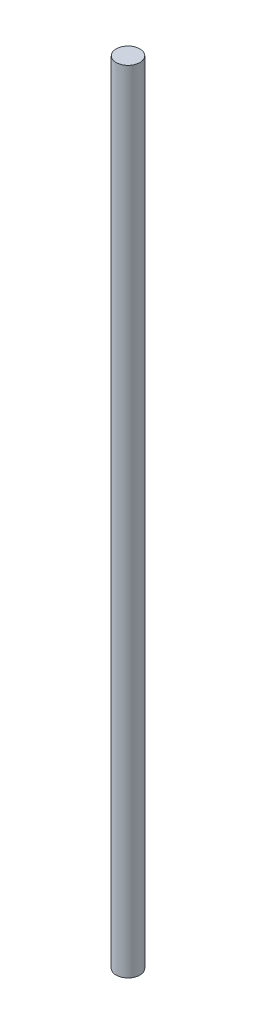
ISO-10303-21;
HEADER;
FILE_DESCRIPTION(('STEP AP214'),'2;1');
FILE_NAME('part.step','',(''),(''),'','','');
FILE_SCHEMA(('AUTOMOTIVE_DESIGN { 1 0 10303 214 1 1 1 1 }'));
ENDSEC;
DATA;
#1=APPLICATION_CONTEXT('core data for automotive mechanical design processes');
#2=APPLICATION_PROTOCOL_DEFINITION('international standard','automotive_design',2000,#1);
#3=PRODUCT_CONTEXT('',#1,'mechanical');
#4=PRODUCT('Part','Part','',(#3));
#5=PRODUCT_RELATED_PRODUCT_CATEGORY('part','',(#4));
#6=PRODUCT_DEFINITION_FORMATION('','',#4);
#7=PRODUCT_DEFINITION_CONTEXT('part definition',#1,'design');
#8=PRODUCT_DEFINITION('design','',#6,#7);
#9=PRODUCT_DEFINITION_SHAPE('','',#8);
#10=(LENGTH_UNIT() NAMED_UNIT(*) SI_UNIT(.MILLI.,.METRE.));
#11=(NAMED_UNIT(*) PLANE_ANGLE_UNIT() SI_UNIT($,.RADIAN.));
#12=(NAMED_UNIT(*) SI_UNIT($,.STERADIAN.) SOLID_ANGLE_UNIT());
#13=UNCERTAINTY_MEASURE_WITH_UNIT(LENGTH_MEASURE(1.E-05),#10,'distance_accuracy_value','');
#14=(GEOMETRIC_REPRESENTATION_CONTEXT(3) GLOBAL_UNCERTAINTY_ASSIGNED_CONTEXT((#13)) GLOBAL_UNIT_ASSIGNED_CONTEXT((#10,
#11,#12)) REPRESENTATION_CONTEXT('',''));
#15=CARTESIAN_POINT('',(0.,0.,0.));
#16=DIRECTION('',(0.,0.,1.));
#17=DIRECTION('',(1.,0.,0.));
#18=AXIS2_PLACEMENT_3D('',#15,#16,#17);
#19=CARTESIAN_POINT('',(-5.32682283546771,200.,0.));
#20=DIRECTION('',(0.,-1.,0.));
#21=DIRECTION('',(0.,0.,-1.));
#22=AXIS2_PLACEMENT_3D('',#19,#20,#21);
#23=CYLINDRICAL_SURFACE('',#22,3.);
#24=CARTESIAN_POINT('',(-5.32682283546771,200.,0.));
#25=DIRECTION('',(0.,1.,0.));
#26=DIRECTION('',(0.,0.,1.));
#27=AXIS2_PLACEMENT_3D('',#24,#25,#26);
#28=CIRCLE('',#27,3.);
#29=CARTESIAN_POINT('',(-5.32682283546771,200.,3.));
#30=VERTEX_POINT('',#29);
#31=EDGE_CURVE('E10',#30,#30,#28,.T.);
#32=ORIENTED_EDGE('',*,*,#31,.F.);
#33=EDGE_LOOP('',(#32));
#34=FACE_BOUND('',#33,.T.);
#35=CARTESIAN_POINT('',(-5.32682283546771,0.,0.));
#36=DIRECTION('',(0.,1.,0.));
#37=DIRECTION('',(0.,0.,1.));
#38=AXIS2_PLACEMENT_3D('',#35,#36,#37);
#39=CIRCLE('',#38,3.);
#40=CARTESIAN_POINT('',(-5.32682283546771,0.,3.));
#41=VERTEX_POINT('',#40);
#42=EDGE_CURVE('E38',#41,#41,#39,.T.);
#43=ORIENTED_EDGE('',*,*,#42,.T.);
#44=EDGE_LOOP('',(#43));
#45=FACE_BOUND('',#44,.T.);
#46=ADVANCED_FACE('F35',(#34,#45),#23,.T.);
#47=CARTESIAN_POINT('',(-5.32682283546771,200.,0.));
#48=DIRECTION('',(0.,1.,0.));
#49=DIRECTION('',(0.,0.,1.));
#50=AXIS2_PLACEMENT_3D('',#47,#48,#49);
#51=PLANE('',#50);
#52=ORIENTED_EDGE('',*,*,#31,.T.);
#53=EDGE_LOOP('',(#52));
#54=FACE_BOUND('',#53,.T.);
#55=ADVANCED_FACE('F50',(#54),#51,.T.);
#56=CARTESIAN_POINT('',(-5.32682283546771,0.,0.));
#57=DIRECTION('',(0.,1.,0.));
#58=DIRECTION('',(0.,0.,1.));
#59=AXIS2_PLACEMENT_3D('',#56,#57,#58);
#60=PLANE('',#59);
#61=ORIENTED_EDGE('',*,*,#42,.F.);
#62=EDGE_LOOP('',(#61));
#63=FACE_BOUND('',#62,.T.);
#64=ADVANCED_FACE('F48',(#63),#60,.F.);
#65=CLOSED_SHELL('',(#46,#55,#64));
#66=MANIFOLD_SOLID_BREP('B2',#65);
#67=ADVANCED_BREP_SHAPE_REPRESENTATION('',(#18,#66),#14);
#68=SHAPE_DEFINITION_REPRESENTATION(#9,#67);
ENDSEC;
END-ISO-10303-21;
